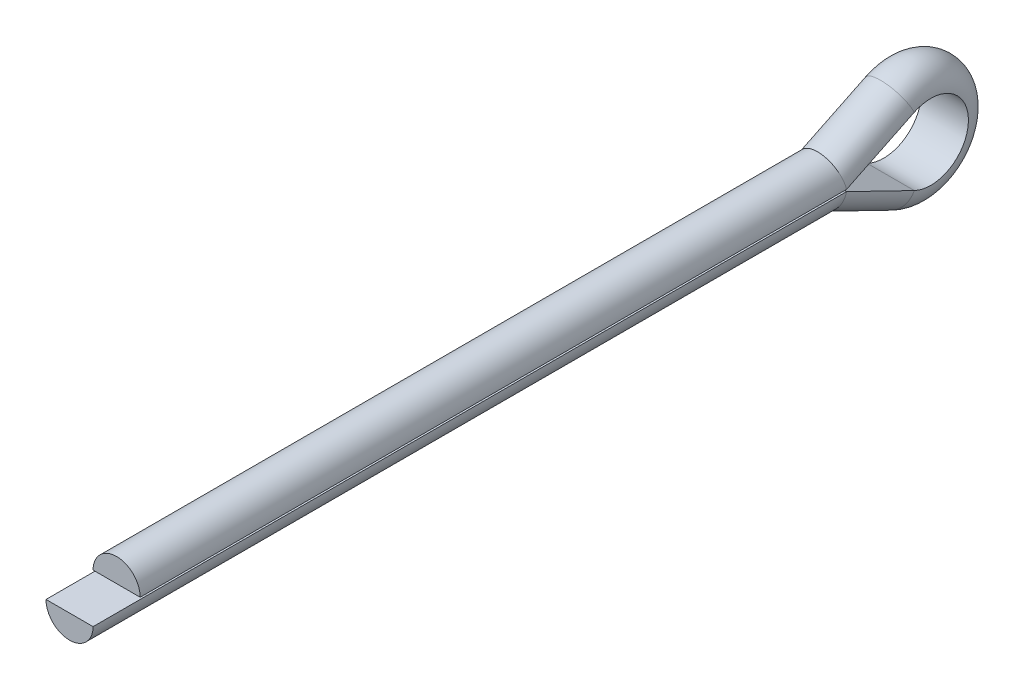
ISO-10303-21;
HEADER;
FILE_DESCRIPTION(('STEP AP214'),'2;1');
FILE_NAME('part.step','',(''),(''),'','','');
FILE_SCHEMA(('AUTOMOTIVE_DESIGN { 1 0 10303 214 1 1 1 1 }'));
ENDSEC;
DATA;
#1=APPLICATION_CONTEXT('core data for automotive mechanical design processes');
#2=APPLICATION_PROTOCOL_DEFINITION('international standard','automotive_design',2000,#1);
#3=PRODUCT_CONTEXT('',#1,'mechanical');
#4=PRODUCT('Part','Part','',(#3));
#5=PRODUCT_RELATED_PRODUCT_CATEGORY('part','',(#4));
#6=PRODUCT_DEFINITION_FORMATION('','',#4);
#7=PRODUCT_DEFINITION_CONTEXT('part definition',#1,'design');
#8=PRODUCT_DEFINITION('design','',#6,#7);
#9=PRODUCT_DEFINITION_SHAPE('','',#8);
#10=(LENGTH_UNIT() NAMED_UNIT(*) SI_UNIT(.MILLI.,.METRE.));
#11=(NAMED_UNIT(*) PLANE_ANGLE_UNIT() SI_UNIT($,.RADIAN.));
#12=(NAMED_UNIT(*) SI_UNIT($,.STERADIAN.) SOLID_ANGLE_UNIT());
#13=UNCERTAINTY_MEASURE_WITH_UNIT(LENGTH_MEASURE(1.E-05),#10,'distance_accuracy_value','');
#14=(GEOMETRIC_REPRESENTATION_CONTEXT(3) GLOBAL_UNCERTAINTY_ASSIGNED_CONTEXT((#13)) GLOBAL_UNIT_ASSIGNED_CONTEXT((#10,
#11,#12)) REPRESENTATION_CONTEXT('',''));
#15=CARTESIAN_POINT('',(0.,0.,0.));
#16=DIRECTION('',(0.,0.,1.));
#17=DIRECTION('',(1.,0.,0.));
#18=AXIS2_PLACEMENT_3D('',#15,#16,#17);
#19=CARTESIAN_POINT('',(-1.5875,-0.127000000000003,-50.8));
#20=DIRECTION('',(0.,-1.,0.));
#21=DIRECTION('',(1.,0.,0.));
#22=AXIS2_PLACEMENT_3D('',#19,#20,#21);
#23=PLANE('',#22);
#24=DIRECTION('',(-1.,0.,0.));
#25=VECTOR('',#24,1.);
#26=CARTESIAN_POINT('',(-1.5875,-0.127000000000009,0.));
#27=LINE('',#26,#25);
#28=CARTESIAN_POINT('',(1.5875,-0.127000000000008,0.));
#29=VERTEX_POINT('',#28);
#30=CARTESIAN_POINT('',(-1.5875,-0.127000000000009,0.));
#31=VERTEX_POINT('',#30);
#32=EDGE_CURVE('E45',#29,#31,#27,.T.);
#33=ORIENTED_EDGE('',*,*,#32,.F.);
#34=DIRECTION('',(0.,0.,1.));
#35=VECTOR('',#34,1.);
#36=CARTESIAN_POINT('',(1.5875,-0.127000000000004,-50.8));
#37=LINE('',#36,#35);
#38=CARTESIAN_POINT('',(1.5875,-0.127000000000004,-50.8));
#39=VERTEX_POINT('',#38);
#40=EDGE_CURVE('E142',#39,#29,#37,.T.);
#41=ORIENTED_EDGE('',*,*,#40,.F.);
#42=DIRECTION('',(1.,0.,0.));
#43=VECTOR('',#42,1.);
#44=CARTESIAN_POINT('',(-1.5875,-0.127000000000003,-50.8));
#45=LINE('',#44,#43);
#46=CARTESIAN_POINT('',(-1.5875,-0.127000000000003,-50.8));
#47=VERTEX_POINT('',#46);
#48=EDGE_CURVE('E138',#47,#39,#45,.T.);
#49=ORIENTED_EDGE('',*,*,#48,.F.);
#50=DIRECTION('',(0.,0.,1.));
#51=VECTOR('',#50,1.);
#52=CARTESIAN_POINT('',(-1.5875,-0.127000000000003,-50.8));
#53=LINE('',#52,#51);
#54=EDGE_CURVE('E144',#47,#31,#53,.T.);
#55=ORIENTED_EDGE('',*,*,#54,.T.);
#56=EDGE_LOOP('',(#33,#41,#49,#55));
#57=FACE_BOUND('',#56,.T.);
#58=ADVANCED_FACE('F37',(#57),#23,.F.);
#59=CARTESIAN_POINT('',(0.,-0.127000000000003,-50.8));
#60=DIRECTION('',(0.,0.,1.));
#61=DIRECTION('',(0.,-1.,0.));
#62=AXIS2_PLACEMENT_3D('',#59,#60,#61);
#63=CYLINDRICAL_SURFACE('',#62,1.5875);
#64=CARTESIAN_POINT('',(0.,-0.127000000000009,0.));
#65=DIRECTION('',(0.,0.,1.));
#66=DIRECTION('',(0.,-1.,0.));
#67=AXIS2_PLACEMENT_3D('',#64,#65,#66);
#68=CIRCLE('',#67,1.5875);
#69=EDGE_CURVE('E12',#31,#29,#68,.T.);
#70=ORIENTED_EDGE('',*,*,#69,.F.);
#71=ORIENTED_EDGE('',*,*,#54,.F.);
#72=CARTESIAN_POINT('',(0.,-0.127000000000003,-50.8));
#73=DIRECTION('',(0.,0.224308618254582,0.974518159798328));
#74=DIRECTION('',(0.,0.974518159798328,-0.224308618254582));
#75=AXIS2_PLACEMENT_3D('',#72,#73,#74);
#76=ELLIPSE('',#75,1.62901017701766,1.5875);
#77=EDGE_CURVE('E141',#39,#47,#76,.F.);
#78=ORIENTED_EDGE('',*,*,#77,.F.);
#79=ORIENTED_EDGE('',*,*,#40,.T.);
#80=EDGE_LOOP('',(#70,#71,#78,#79));
#81=FACE_BOUND('',#80,.T.);
#82=ADVANCED_FACE('F39',(#81),#63,.T.);
#83=CARTESIAN_POINT('',(0.,-2.34790307038573,-55.3688061407714));
#84=DIRECTION('',(0.,0.437185643776721,0.899371287553441));
#85=DIRECTION('',(0.,-0.899371287553441,0.437185643776721));
#86=AXIS2_PLACEMENT_3D('',#83,#84,#85);
#87=CYLINDRICAL_SURFACE('',#86,1.5875);
#88=DIRECTION('',(0.,0.437185643776721,0.899371287553441));
#89=VECTOR('',#88,1.);
#90=CARTESIAN_POINT('',(1.5875,-2.34790307038573,-55.3688061407714));
#91=LINE('',#90,#89);
#92=CARTESIAN_POINT('',(1.5875,-2.34790307038573,-55.3688061407714));
#93=VERTEX_POINT('',#92);
#94=EDGE_CURVE('E135',#93,#39,#91,.T.);
#95=ORIENTED_EDGE('',*,*,#94,.T.);
#96=ORIENTED_EDGE('',*,*,#77,.T.);
#97=DIRECTION('',(0.,0.437185643776721,0.899371287553441));
#98=VECTOR('',#97,1.);
#99=CARTESIAN_POINT('',(-1.5875,-2.34790307038573,-55.3688061407714));
#100=LINE('',#99,#98);
#101=CARTESIAN_POINT('',(-1.5875,-2.34790307038573,-55.3688061407714));
#102=VERTEX_POINT('',#101);
#103=EDGE_CURVE('E132',#102,#47,#100,.T.);
#104=ORIENTED_EDGE('',*,*,#103,.F.);
#105=CARTESIAN_POINT('',(0.,-2.34790307038573,-55.3688061407714));
#106=DIRECTION('',(0.,0.437185643776734,0.899371287553434));
#107=DIRECTION('',(0.,-0.899371287553435,0.437185643776734));
#108=AXIS2_PLACEMENT_3D('',#105,#106,#107);
#109=CIRCLE('',#108,1.5875);
#110=EDGE_CURVE('E120',#102,#93,#109,.T.);
#111=ORIENTED_EDGE('',*,*,#110,.T.);
#112=EDGE_LOOP('',(#95,#96,#104,#111));
#113=FACE_BOUND('',#112,.T.);
#114=ADVANCED_FACE('F168',(#113),#87,.T.);
#115=CARTESIAN_POINT('',(-1.5875,-2.34790307038573,-55.3688061407714));
#116=DIRECTION('',(0.,0.899371287553441,-0.437185643776721));
#117=DIRECTION('',(0.,0.437185643776721,0.899371287553441));
#118=AXIS2_PLACEMENT_3D('',#115,#116,#117);
#119=PLANE('',#118);
#120=ORIENTED_EDGE('',*,*,#103,.T.);
#121=ORIENTED_EDGE('',*,*,#48,.T.);
#122=ORIENTED_EDGE('',*,*,#94,.F.);
#123=DIRECTION('',(-1.,0.,0.));
#124=VECTOR('',#123,1.);
#125=CARTESIAN_POINT('',(-1.5875,-2.34790307038573,-55.3688061407714));
#126=LINE('',#125,#124);
#127=EDGE_CURVE('E123',#93,#102,#126,.T.);
#128=ORIENTED_EDGE('',*,*,#127,.T.);
#129=EDGE_LOOP('',(#120,#121,#122,#128));
#130=FACE_BOUND('',#129,.T.);
#131=ADVANCED_FACE('F166',(#130),#119,.T.);
#132=CARTESIAN_POINT('',(0.,-0.0634999999999993,-56.4792576759644));
#133=DIRECTION('',(-1.,0.,0.));
#134=DIRECTION('',(0.,0.,1.));
#135=AXIS2_PLACEMENT_3D('',#132,#133,#134);
#136=CYLINDRICAL_SURFACE('',#135,2.54);
#137=DIRECTION('',(-1.,0.,0.));
#138=VECTOR('',#137,1.);
#139=CARTESIAN_POINT('',(-1.5875,2.22090307038574,-55.3688061407715));
#140=LINE('',#139,#138);
#141=CARTESIAN_POINT('',(1.5875,2.22090307038574,-55.3688061407715));
#142=VERTEX_POINT('',#141);
#143=CARTESIAN_POINT('',(-1.5875,2.22090307038574,-55.3688061407715));
#144=VERTEX_POINT('',#143);
#145=EDGE_CURVE('E117',#142,#144,#140,.T.);
#146=ORIENTED_EDGE('',*,*,#145,.T.);
#147=CARTESIAN_POINT('',(-1.5875,-0.0634999999999993,-56.4792576759644));
#148=DIRECTION('',(-1.,0.,0.));
#149=DIRECTION('',(0.,0.,1.));
#150=AXIS2_PLACEMENT_3D('',#147,#148,#149);
#151=CIRCLE('',#150,2.54);
#152=EDGE_CURVE('E126',#144,#102,#151,.T.);
#153=ORIENTED_EDGE('',*,*,#152,.T.);
#154=ORIENTED_EDGE('',*,*,#127,.F.);
#155=CARTESIAN_POINT('',(1.5875,-0.0634999999999993,-56.4792576759644));
#156=DIRECTION('',(-1.,0.,0.));
#157=DIRECTION('',(0.,0.,1.));
#158=AXIS2_PLACEMENT_3D('',#155,#156,#157);
#159=CIRCLE('',#158,2.54);
#160=EDGE_CURVE('E129',#142,#93,#159,.T.);
#161=ORIENTED_EDGE('',*,*,#160,.F.);
#162=EDGE_LOOP('',(#146,#153,#154,#161));
#163=FACE_BOUND('',#162,.T.);
#164=ADVANCED_FACE('F164',(#163),#136,.F.);
#165=CARTESIAN_POINT('',(0.,-0.0634999999999993,-56.4792576759644));
#166=DIRECTION('',(-1.,0.,0.));
#167=DIRECTION('',(0.,0.,1.));
#168=AXIS2_PLACEMENT_3D('',#165,#166,#167);
#169=TOROIDAL_SURFACE('',#168,2.54,1.5875);
#170=CARTESIAN_POINT('',(0.,2.22090307038574,-55.3688061407715));
#171=DIRECTION('',(0.,0.437185643776722,-0.89937128755344));
#172=DIRECTION('',(0.,0.899371287553441,0.437185643776722));
#173=AXIS2_PLACEMENT_3D('',#170,#171,#172);
#174=CIRCLE('',#173,1.5875);
#175=EDGE_CURVE('E116',#144,#142,#174,.T.);
#176=ORIENTED_EDGE('',*,*,#175,.T.);
#177=ORIENTED_EDGE('',*,*,#160,.T.);
#178=ORIENTED_EDGE('',*,*,#110,.F.);
#179=ORIENTED_EDGE('',*,*,#152,.F.);
#180=EDGE_LOOP('',(#176,#177,#178,#179));
#181=FACE_BOUND('',#180,.T.);
#182=ADVANCED_FACE('F160',(#181),#169,.T.);
#183=CARTESIAN_POINT('',(0.,0.,-50.8));
#184=DIRECTION('',(0.,0.43718564377672,-0.899371287553441));
#185=DIRECTION('',(0.,0.899371287553441,0.43718564377672));
#186=AXIS2_PLACEMENT_3D('',#183,#184,#185);
#187=CYLINDRICAL_SURFACE('',#186,1.5875);
#188=ORIENTED_EDGE('',*,*,#175,.F.);
#189=DIRECTION('',(0.,0.43718564377672,-0.899371287553441));
#190=VECTOR('',#189,1.);
#191=CARTESIAN_POINT('',(-1.5875,0.,-50.8));
#192=LINE('',#191,#190);
#193=CARTESIAN_POINT('',(-1.5875,0.,-50.8));
#194=VERTEX_POINT('',#193);
#195=EDGE_CURVE('E110',#194,#144,#192,.T.);
#196=ORIENTED_EDGE('',*,*,#195,.F.);
#197=CARTESIAN_POINT('',(0.,0.,-50.8));
#198=DIRECTION('',(0.,0.224308618254581,-0.974518159798329));
#199=DIRECTION('',(0.,0.974518159798329,0.224308618254581));
#200=AXIS2_PLACEMENT_3D('',#197,#198,#199);
#201=ELLIPSE('',#200,1.62901017701766,1.5875);
#202=CARTESIAN_POINT('',(1.5875,0.,-50.8));
#203=VERTEX_POINT('',#202);
#204=EDGE_CURVE('E93',#203,#194,#201,.F.);
#205=ORIENTED_EDGE('',*,*,#204,.F.);
#206=DIRECTION('',(0.,0.43718564377672,-0.899371287553441));
#207=VECTOR('',#206,1.);
#208=CARTESIAN_POINT('',(1.5875,0.,-50.8));
#209=LINE('',#208,#207);
#210=EDGE_CURVE('E113',#203,#142,#209,.T.);
#211=ORIENTED_EDGE('',*,*,#210,.T.);
#212=EDGE_LOOP('',(#188,#196,#205,#211));
#213=FACE_BOUND('',#212,.T.);
#214=ADVANCED_FACE('F158',(#213),#187,.T.);
#215=CARTESIAN_POINT('',(-1.5875,0.,-50.8));
#216=DIRECTION('',(0.,0.899371287553441,0.43718564377672));
#217=DIRECTION('',(0.,-0.43718564377672,0.899371287553441));
#218=AXIS2_PLACEMENT_3D('',#215,#216,#217);
#219=PLANE('',#218);
#220=ORIENTED_EDGE('',*,*,#145,.F.);
#221=ORIENTED_EDGE('',*,*,#210,.F.);
#222=DIRECTION('',(1.,0.,0.));
#223=VECTOR('',#222,1.);
#224=CARTESIAN_POINT('',(-1.5875,0.,-50.8));
#225=LINE('',#224,#223);
#226=EDGE_CURVE('E109',#194,#203,#225,.T.);
#227=ORIENTED_EDGE('',*,*,#226,.F.);
#228=ORIENTED_EDGE('',*,*,#195,.T.);
#229=EDGE_LOOP('',(#220,#221,#227,#228));
#230=FACE_BOUND('',#229,.T.);
#231=ADVANCED_FACE('F155',(#230),#219,.F.);
#232=CARTESIAN_POINT('',(0.,0.,-3.175));
#233=DIRECTION('',(0.,0.,-1.));
#234=DIRECTION('',(-1.,0.,0.));
#235=AXIS2_PLACEMENT_3D('',#232,#233,#234);
#236=PLANE('',#235);
#237=CARTESIAN_POINT('',(0.,0.,-3.175));
#238=DIRECTION('',(0.,0.,1.));
#239=DIRECTION('',(-1.,0.,0.));
#240=AXIS2_PLACEMENT_3D('',#237,#238,#239);
#241=CIRCLE('',#240,1.5875);
#242=CARTESIAN_POINT('',(1.5875,0.,-3.175));
#243=VERTEX_POINT('',#242);
#244=CARTESIAN_POINT('',(-1.5875,0.,-3.175));
#245=VERTEX_POINT('',#244);
#246=EDGE_CURVE('E90',#243,#245,#241,.T.);
#247=ORIENTED_EDGE('',*,*,#246,.T.);
#248=DIRECTION('',(1.,0.,0.));
#249=VECTOR('',#248,1.);
#250=CARTESIAN_POINT('',(-1.5875,0.,-3.175));
#251=LINE('',#250,#249);
#252=EDGE_CURVE('E98',#245,#243,#251,.T.);
#253=ORIENTED_EDGE('',*,*,#252,.T.);
#254=EDGE_LOOP('',(#247,#253));
#255=FACE_BOUND('',#254,.T.);
#256=ADVANCED_FACE('F101',(#255),#236,.F.);
#257=CARTESIAN_POINT('',(0.,0.,-54.1670574033162));
#258=DIRECTION('',(0.,0.,1.));
#259=DIRECTION('',(0.,-1.,0.));
#260=AXIS2_PLACEMENT_3D('',#257,#258,#259);
#261=CYLINDRICAL_SURFACE('',#260,1.5875);
#262=DIRECTION('',(0.,0.,1.));
#263=VECTOR('',#262,1.);
#264=CARTESIAN_POINT('',(1.5875,0.,-54.1670574033162));
#265=LINE('',#264,#263);
#266=EDGE_CURVE('E97',#203,#243,#265,.T.);
#267=ORIENTED_EDGE('',*,*,#266,.F.);
#268=ORIENTED_EDGE('',*,*,#204,.T.);
#269=DIRECTION('',(0.,0.,1.));
#270=VECTOR('',#269,1.);
#271=CARTESIAN_POINT('',(-1.5875,0.,-54.1670574033162));
#272=LINE('',#271,#270);
#273=EDGE_CURVE('E86',#194,#245,#272,.T.);
#274=ORIENTED_EDGE('',*,*,#273,.T.);
#275=ORIENTED_EDGE('',*,*,#246,.F.);
#276=EDGE_LOOP('',(#267,#268,#274,#275));
#277=FACE_BOUND('',#276,.T.);
#278=ADVANCED_FACE('F89',(#277),#261,.T.);
#279=CARTESIAN_POINT('',(-1.5875,0.,-54.1670574033162));
#280=DIRECTION('',(0.,-1.,0.));
#281=DIRECTION('',(1.,0.,0.));
#282=AXIS2_PLACEMENT_3D('',#279,#280,#281);
#283=PLANE('',#282);
#284=ORIENTED_EDGE('',*,*,#273,.F.);
#285=ORIENTED_EDGE('',*,*,#226,.T.);
#286=ORIENTED_EDGE('',*,*,#266,.T.);
#287=ORIENTED_EDGE('',*,*,#252,.F.);
#288=EDGE_LOOP('',(#284,#285,#286,#287));
#289=FACE_BOUND('',#288,.T.);
#290=ADVANCED_FACE('F103',(#289),#283,.T.);
#291=CARTESIAN_POINT('',(0.,-0.920750000000009,0.));
#292=DIRECTION('',(0.,0.,1.));
#293=DIRECTION('',(0.,-1.,0.));
#294=AXIS2_PLACEMENT_3D('',#291,#292,#293);
#295=PLANE('',#294);
#296=ORIENTED_EDGE('',*,*,#32,.T.);
#297=ORIENTED_EDGE('',*,*,#69,.T.);
#298=EDGE_LOOP('',(#296,#297));
#299=FACE_BOUND('',#298,.T.);
#300=ADVANCED_FACE('F192',(#299),#295,.T.);
#301=CLOSED_SHELL('',(#58,#82,#114,#131,#164,#182,#214,#231,#256,#278,#290,#300));
#302=MANIFOLD_SOLID_BREP('B2',#301);
#303=ADVANCED_BREP_SHAPE_REPRESENTATION('',(#18,#302),#14);
#304=SHAPE_DEFINITION_REPRESENTATION(#9,#303);
ENDSEC;
END-ISO-10303-21;
